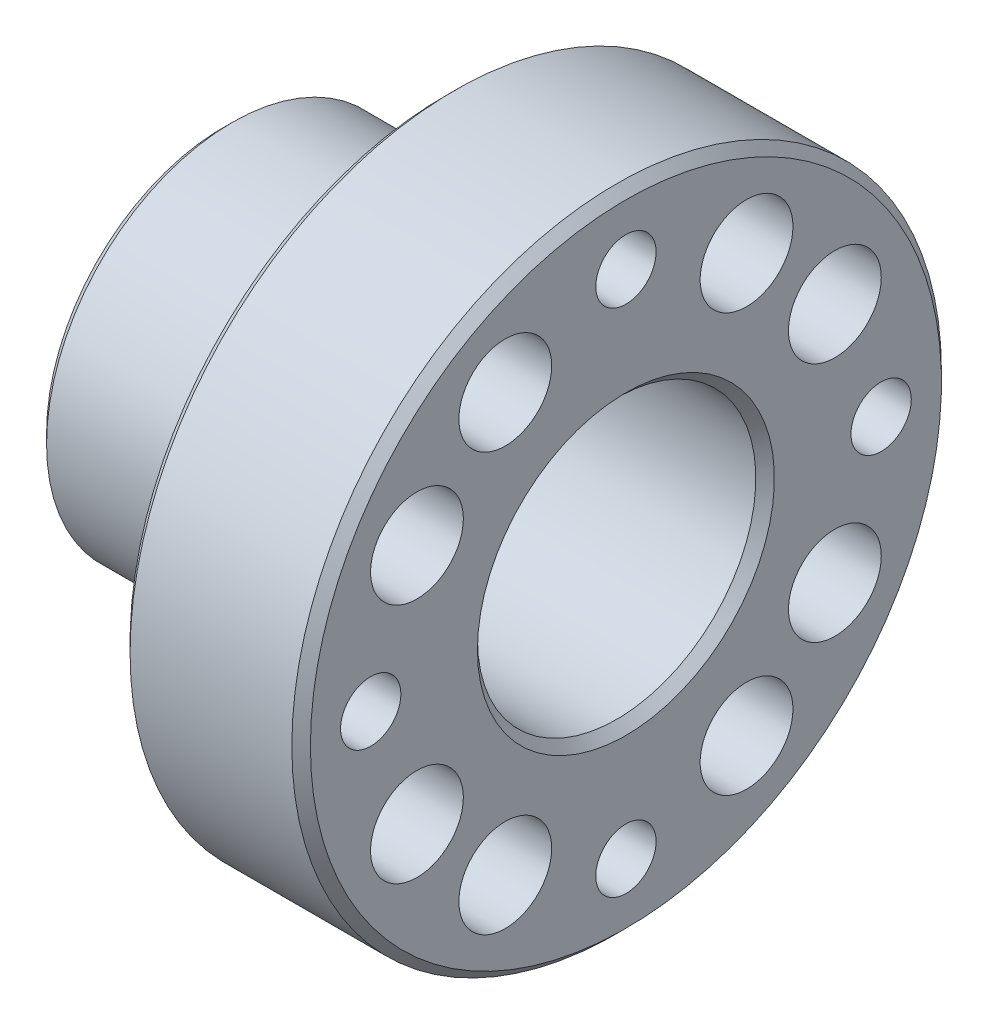
ISO-10303-21;
HEADER;
FILE_DESCRIPTION(('STEP AP214'),'2;1');
FILE_NAME('part.step','',(''),(''),'','','');
FILE_SCHEMA(('AUTOMOTIVE_DESIGN { 1 0 10303 214 1 1 1 1 }'));
ENDSEC;
DATA;
#1=APPLICATION_CONTEXT('core data for automotive mechanical design processes');
#2=APPLICATION_PROTOCOL_DEFINITION('international standard','automotive_design',2000,#1);
#3=PRODUCT_CONTEXT('',#1,'mechanical');
#4=PRODUCT('Part','Part','',(#3));
#5=PRODUCT_RELATED_PRODUCT_CATEGORY('part','',(#4));
#6=PRODUCT_DEFINITION_FORMATION('','',#4);
#7=PRODUCT_DEFINITION_CONTEXT('part definition',#1,'design');
#8=PRODUCT_DEFINITION('design','',#6,#7);
#9=PRODUCT_DEFINITION_SHAPE('','',#8);
#10=(LENGTH_UNIT() NAMED_UNIT(*) SI_UNIT(.MILLI.,.METRE.));
#11=(NAMED_UNIT(*) PLANE_ANGLE_UNIT() SI_UNIT($,.RADIAN.));
#12=(NAMED_UNIT(*) SI_UNIT($,.STERADIAN.) SOLID_ANGLE_UNIT());
#13=UNCERTAINTY_MEASURE_WITH_UNIT(LENGTH_MEASURE(1.E-05),#10,'distance_accuracy_value','');
#14=(GEOMETRIC_REPRESENTATION_CONTEXT(3) GLOBAL_UNCERTAINTY_ASSIGNED_CONTEXT((#13)) GLOBAL_UNIT_ASSIGNED_CONTEXT((#10,
#11,#12)) REPRESENTATION_CONTEXT('',''));
#15=CARTESIAN_POINT('',(0.,0.,0.));
#16=DIRECTION('',(0.,0.,1.));
#17=DIRECTION('',(1.,0.,0.));
#18=AXIS2_PLACEMENT_3D('',#15,#16,#17);
#19=CARTESIAN_POINT('',(0.,0.,-15.));
#20=DIRECTION('',(1.,0.,0.));
#21=DIRECTION('',(0.,0.,-1.));
#22=AXIS2_PLACEMENT_3D('',#19,#20,#21);
#23=PLANE('',#22);
#24=CARTESIAN_POINT('',(0.,0.,0.));
#25=DIRECTION('',(1.,0.,0.));
#26=DIRECTION('',(0.,0.,-1.));
#27=AXIS2_PLACEMENT_3D('',#24,#25,#26);
#28=CIRCLE('',#27,19.);
#29=CARTESIAN_POINT('',(0.,0.,-19.));
#30=VERTEX_POINT('',#29);
#31=EDGE_CURVE('E161',#30,#30,#28,.F.);
#32=ORIENTED_EDGE('',*,*,#31,.T.);
#33=EDGE_LOOP('',(#32));
#34=FACE_BOUND('',#33,.T.);
#35=CARTESIAN_POINT('',(0.,0.,0.));
#36=DIRECTION('',(1.,0.,0.));
#37=DIRECTION('',(0.,0.,-1.));
#38=AXIS2_PLACEMENT_3D('',#35,#36,#37);
#39=CIRCLE('',#38,16.);
#40=CARTESIAN_POINT('',(0.,0.,-16.));
#41=VERTEX_POINT('',#40);
#42=EDGE_CURVE('E158',#41,#41,#39,.T.);
#43=ORIENTED_EDGE('',*,*,#42,.T.);
#44=EDGE_LOOP('',(#43));
#45=FACE_BOUND('',#44,.T.);
#46=ADVANCED_FACE('F41',(#34,#45),#23,.F.);
#47=CARTESIAN_POINT('',(0.,0.,0.));
#48=DIRECTION('',(-1.,0.,0.));
#49=DIRECTION('',(0.,0.,1.));
#50=AXIS2_PLACEMENT_3D('',#47,#48,#49);
#51=CYLINDRICAL_SURFACE('',#50,20.);
#52=CARTESIAN_POINT('',(23.,0.,0.));
#53=DIRECTION('',(1.,0.,0.));
#54=DIRECTION('',(0.,0.,-1.));
#55=AXIS2_PLACEMENT_3D('',#52,#53,#54);
#56=CIRCLE('',#55,20.);
#57=CARTESIAN_POINT('',(23.,0.,-20.));
#58=VERTEX_POINT('',#57);
#59=EDGE_CURVE('E154',#58,#58,#56,.F.);
#60=ORIENTED_EDGE('',*,*,#59,.T.);
#61=EDGE_LOOP('',(#60));
#62=FACE_BOUND('',#61,.T.);
#63=CARTESIAN_POINT('',(1.00000000000001,0.,0.));
#64=DIRECTION('',(1.,0.,0.));
#65=DIRECTION('',(0.,0.,-1.));
#66=AXIS2_PLACEMENT_3D('',#63,#64,#65);
#67=CIRCLE('',#66,20.);
#68=CARTESIAN_POINT('',(1.00000000000001,0.,-20.));
#69=VERTEX_POINT('',#68);
#70=EDGE_CURVE('E151',#69,#69,#67,.T.);
#71=ORIENTED_EDGE('',*,*,#70,.T.);
#72=EDGE_LOOP('',(#71));
#73=FACE_BOUND('',#72,.T.);
#74=ADVANCED_FACE('F195',(#62,#73),#51,.T.);
#75=CARTESIAN_POINT('',(24.,0.,-20.));
#76=DIRECTION('',(1.,0.,0.));
#77=DIRECTION('',(0.,0.,-1.));
#78=AXIS2_PLACEMENT_3D('',#75,#76,#77);
#79=PLANE('',#78);
#80=CARTESIAN_POINT('',(24.,0.,0.));
#81=DIRECTION('',(1.,0.,0.));
#82=DIRECTION('',(0.,0.,-1.));
#83=AXIS2_PLACEMENT_3D('',#80,#81,#82);
#84=CIRCLE('',#83,34.);
#85=CARTESIAN_POINT('',(24.,0.,-34.));
#86=VERTEX_POINT('',#85);
#87=EDGE_CURVE('E147',#86,#86,#84,.F.);
#88=ORIENTED_EDGE('',*,*,#87,.T.);
#89=EDGE_LOOP('',(#88));
#90=FACE_BOUND('',#89,.T.);
#91=CARTESIAN_POINT('',(24.,0.,0.));
#92=DIRECTION('',(1.,0.,0.));
#93=DIRECTION('',(0.,0.,-1.));
#94=AXIS2_PLACEMENT_3D('',#91,#92,#93);
#95=CIRCLE('',#94,21.);
#96=CARTESIAN_POINT('',(24.,18.1865334794732,-10.5));
#97=VERTEX_POINT('',#96);
#98=CARTESIAN_POINT('',(24.,18.1865334794732,10.5));
#99=VERTEX_POINT('',#98);
#100=EDGE_CURVE('E98',#97,#99,#95,.T.);
#101=ORIENTED_EDGE('',*,*,#100,.T.);
#102=CARTESIAN_POINT('',(24.,22.5166604983954,13.));
#103=DIRECTION('',(1.,0.,0.));
#104=DIRECTION('',(0.,0.,-1.));
#105=AXIS2_PLACEMENT_3D('',#102,#103,#104);
#106=CIRCLE('',#105,5.);
#107=EDGE_CURVE('E54',#99,#99,#106,.T.);
#108=ORIENTED_EDGE('',*,*,#107,.T.);
#109=CARTESIAN_POINT('',(24.,10.5,18.1865334794732));
#110=VERTEX_POINT('',#109);
#111=EDGE_CURVE('E60',#99,#110,#95,.T.);
#112=ORIENTED_EDGE('',*,*,#111,.T.);
#113=CARTESIAN_POINT('',(24.,13.,22.5166604983954));
#114=DIRECTION('',(1.,0.,0.));
#115=DIRECTION('',(0.,0.,-1.));
#116=AXIS2_PLACEMENT_3D('',#113,#114,#115);
#117=CIRCLE('',#116,5.);
#118=EDGE_CURVE('E292',#110,#110,#117,.T.);
#119=ORIENTED_EDGE('',*,*,#118,.T.);
#120=CARTESIAN_POINT('',(24.,-10.5,18.1865334794732));
#121=VERTEX_POINT('',#120);
#122=EDGE_CURVE('E329',#110,#121,#95,.T.);
#123=ORIENTED_EDGE('',*,*,#122,.T.);
#124=CARTESIAN_POINT('',(24.,-13.,22.5166604983954));
#125=DIRECTION('',(1.,0.,0.));
#126=DIRECTION('',(0.,0.,-1.));
#127=AXIS2_PLACEMENT_3D('',#124,#125,#126);
#128=CIRCLE('',#127,5.);
#129=EDGE_CURVE('E297',#121,#121,#128,.T.);
#130=ORIENTED_EDGE('',*,*,#129,.T.);
#131=CARTESIAN_POINT('',(24.,-18.1865334794732,10.5));
#132=VERTEX_POINT('',#131);
#133=EDGE_CURVE('E326',#121,#132,#95,.T.);
#134=ORIENTED_EDGE('',*,*,#133,.T.);
#135=CARTESIAN_POINT('',(24.,-22.5166604983954,13.));
#136=DIRECTION('',(1.,0.,0.));
#137=DIRECTION('',(0.,0.,-1.));
#138=AXIS2_PLACEMENT_3D('',#135,#136,#137);
#139=CIRCLE('',#138,5.);
#140=EDGE_CURVE('E303',#132,#132,#139,.T.);
#141=ORIENTED_EDGE('',*,*,#140,.T.);
#142=CARTESIAN_POINT('',(24.,-18.1865334794732,-10.5));
#143=VERTEX_POINT('',#142);
#144=EDGE_CURVE('E323',#132,#143,#95,.T.);
#145=ORIENTED_EDGE('',*,*,#144,.T.);
#146=CARTESIAN_POINT('',(24.,-22.5166604983954,-13.));
#147=DIRECTION('',(1.,0.,0.));
#148=DIRECTION('',(0.,0.,-1.));
#149=AXIS2_PLACEMENT_3D('',#146,#147,#148);
#150=CIRCLE('',#149,5.);
#151=EDGE_CURVE('E309',#143,#143,#150,.T.);
#152=ORIENTED_EDGE('',*,*,#151,.T.);
#153=CARTESIAN_POINT('',(24.,-10.5,-18.1865334794732));
#154=VERTEX_POINT('',#153);
#155=EDGE_CURVE('E322',#143,#154,#95,.T.);
#156=ORIENTED_EDGE('',*,*,#155,.T.);
#157=CARTESIAN_POINT('',(24.,-13.,-22.5166604983954));
#158=DIRECTION('',(1.,0.,0.));
#159=DIRECTION('',(0.,0.,-1.));
#160=AXIS2_PLACEMENT_3D('',#157,#158,#159);
#161=CIRCLE('',#160,5.);
#162=EDGE_CURVE('E315',#154,#154,#161,.T.);
#163=ORIENTED_EDGE('',*,*,#162,.T.);
#164=CARTESIAN_POINT('',(24.,10.5,-18.1865334794732));
#165=VERTEX_POINT('',#164);
#166=EDGE_CURVE('E95',#154,#165,#95,.T.);
#167=ORIENTED_EDGE('',*,*,#166,.T.);
#168=CARTESIAN_POINT('',(24.,13.,-22.5166604983954));
#169=DIRECTION('',(1.,0.,0.));
#170=DIRECTION('',(0.,0.,-1.));
#171=AXIS2_PLACEMENT_3D('',#168,#169,#170);
#172=CIRCLE('',#171,5.);
#173=EDGE_CURVE('E91',#165,#165,#172,.T.);
#174=ORIENTED_EDGE('',*,*,#173,.T.);
#175=EDGE_CURVE('E83',#165,#97,#95,.T.);
#176=ORIENTED_EDGE('',*,*,#175,.T.);
#177=CARTESIAN_POINT('',(24.,22.5166604983954,-13.));
#178=DIRECTION('',(1.,0.,0.));
#179=DIRECTION('',(0.,0.,-1.));
#180=AXIS2_PLACEMENT_3D('',#177,#178,#179);
#181=CIRCLE('',#180,5.);
#182=EDGE_CURVE('E88',#97,#97,#181,.T.);
#183=ORIENTED_EDGE('',*,*,#182,.T.);
#184=EDGE_LOOP('',(#101,#108,#112,#119,#123,#130,#134,#141,#145,#152,#156,#163,#167,#174,#176,#183));
#185=FACE_BOUND('',#184,.T.);
#186=CARTESIAN_POINT('',(24.,-27.5,0.));
#187=DIRECTION('',(1.,0.,0.));
#188=DIRECTION('',(0.,0.,-1.));
#189=AXIS2_PLACEMENT_3D('',#186,#187,#188);
#190=CIRCLE('',#189,3.25);
#191=CARTESIAN_POINT('',(24.,-27.5,-3.25));
#192=VERTEX_POINT('',#191);
#193=EDGE_CURVE('E107',#192,#192,#190,.T.);
#194=ORIENTED_EDGE('',*,*,#193,.T.);
#195=EDGE_LOOP('',(#194));
#196=FACE_BOUND('',#195,.T.);
#197=CARTESIAN_POINT('',(24.,0.,27.5));
#198=DIRECTION('',(1.,0.,0.));
#199=DIRECTION('',(0.,0.,-1.));
#200=AXIS2_PLACEMENT_3D('',#197,#198,#199);
#201=CIRCLE('',#200,3.25);
#202=CARTESIAN_POINT('',(24.,0.,24.25));
#203=VERTEX_POINT('',#202);
#204=EDGE_CURVE('E119',#203,#203,#201,.T.);
#205=ORIENTED_EDGE('',*,*,#204,.T.);
#206=EDGE_LOOP('',(#205));
#207=FACE_BOUND('',#206,.T.);
#208=CARTESIAN_POINT('',(24.,0.,-27.5));
#209=DIRECTION('',(1.,0.,0.));
#210=DIRECTION('',(0.,0.,-1.));
#211=AXIS2_PLACEMENT_3D('',#208,#209,#210);
#212=CIRCLE('',#211,3.25);
#213=CARTESIAN_POINT('',(24.,0.,-30.75));
#214=VERTEX_POINT('',#213);
#215=EDGE_CURVE('E125',#214,#214,#212,.T.);
#216=ORIENTED_EDGE('',*,*,#215,.T.);
#217=EDGE_LOOP('',(#216));
#218=FACE_BOUND('',#217,.T.);
#219=CARTESIAN_POINT('',(24.,27.5,0.));
#220=DIRECTION('',(1.,0.,0.));
#221=DIRECTION('',(0.,0.,-1.));
#222=AXIS2_PLACEMENT_3D('',#219,#220,#221);
#223=CIRCLE('',#222,3.25);
#224=CARTESIAN_POINT('',(24.,27.5,-3.25));
#225=VERTEX_POINT('',#224);
#226=EDGE_CURVE('E132',#225,#225,#223,.T.);
#227=ORIENTED_EDGE('',*,*,#226,.T.);
#228=EDGE_LOOP('',(#227));
#229=FACE_BOUND('',#228,.T.);
#230=ADVANCED_FACE('F86',(#90,#185,#196,#207,#218,#229),#79,.F.);
#231=CARTESIAN_POINT('',(0.,0.,0.));
#232=DIRECTION('',(-1.,0.,0.));
#233=DIRECTION('',(0.,0.,1.));
#234=AXIS2_PLACEMENT_3D('',#231,#232,#233);
#235=CYLINDRICAL_SURFACE('',#234,35.);
#236=CARTESIAN_POINT('',(42.43,0.,0.));
#237=DIRECTION('',(-1.,0.,0.));
#238=DIRECTION('',(0.,0.,1.));
#239=AXIS2_PLACEMENT_3D('',#236,#237,#238);
#240=CIRCLE('',#239,35.);
#241=CARTESIAN_POINT('',(42.43,0.,35.));
#242=VERTEX_POINT('',#241);
#243=EDGE_CURVE('E139',#242,#242,#240,.T.);
#244=ORIENTED_EDGE('',*,*,#243,.T.);
#245=EDGE_LOOP('',(#244));
#246=FACE_BOUND('',#245,.T.);
#247=CARTESIAN_POINT('',(25.,0.,0.));
#248=DIRECTION('',(1.,0.,0.));
#249=DIRECTION('',(0.,0.,-1.));
#250=AXIS2_PLACEMENT_3D('',#247,#248,#249);
#251=CIRCLE('',#250,35.);
#252=CARTESIAN_POINT('',(25.,0.,-35.));
#253=VERTEX_POINT('',#252);
#254=EDGE_CURVE('E135',#253,#253,#251,.T.);
#255=ORIENTED_EDGE('',*,*,#254,.T.);
#256=EDGE_LOOP('',(#255));
#257=FACE_BOUND('',#256,.T.);
#258=ADVANCED_FACE('F176',(#246,#257),#235,.T.);
#259=CARTESIAN_POINT('',(43.43,0.,-35.));
#260=DIRECTION('',(-1.,0.,0.));
#261=DIRECTION('',(0.,0.,1.));
#262=AXIS2_PLACEMENT_3D('',#259,#260,#261);
#263=PLANE('',#262);
#264=CARTESIAN_POINT('',(43.43,22.5166604983954,13.));
#265=DIRECTION('',(1.,0.,0.));
#266=DIRECTION('',(0.,0.,-1.));
#267=AXIS2_PLACEMENT_3D('',#264,#265,#266);
#268=CIRCLE('',#267,5.);
#269=CARTESIAN_POINT('',(43.43,22.5166604983954,8.00000000000001));
#270=VERTEX_POINT('',#269);
#271=EDGE_CURVE('E285',#270,#270,#268,.T.);
#272=ORIENTED_EDGE('',*,*,#271,.F.);
#273=EDGE_LOOP('',(#272));
#274=FACE_BOUND('',#273,.T.);
#275=CARTESIAN_POINT('',(43.43,13.,22.5166604983954));
#276=DIRECTION('',(1.,0.,0.));
#277=DIRECTION('',(0.,0.,-1.));
#278=AXIS2_PLACEMENT_3D('',#275,#276,#277);
#279=CIRCLE('',#278,5.);
#280=CARTESIAN_POINT('',(43.43,13.,17.5166604983954));
#281=VERTEX_POINT('',#280);
#282=EDGE_CURVE('E287',#281,#281,#279,.T.);
#283=ORIENTED_EDGE('',*,*,#282,.F.);
#284=EDGE_LOOP('',(#283));
#285=FACE_BOUND('',#284,.T.);
#286=CARTESIAN_POINT('',(43.43,-13.,22.5166604983954));
#287=DIRECTION('',(1.,0.,0.));
#288=DIRECTION('',(0.,0.,-1.));
#289=AXIS2_PLACEMENT_3D('',#286,#287,#288);
#290=CIRCLE('',#289,5.);
#291=CARTESIAN_POINT('',(43.43,-13.,17.5166604983954));
#292=VERTEX_POINT('',#291);
#293=EDGE_CURVE('E294',#292,#292,#290,.T.);
#294=ORIENTED_EDGE('',*,*,#293,.F.);
#295=EDGE_LOOP('',(#294));
#296=FACE_BOUND('',#295,.T.);
#297=CARTESIAN_POINT('',(43.43,-22.5166604983954,13.));
#298=DIRECTION('',(1.,0.,0.));
#299=DIRECTION('',(0.,0.,-1.));
#300=AXIS2_PLACEMENT_3D('',#297,#298,#299);
#301=CIRCLE('',#300,5.);
#302=CARTESIAN_POINT('',(43.43,-22.5166604983954,8.00000000000001));
#303=VERTEX_POINT('',#302);
#304=EDGE_CURVE('E300',#303,#303,#301,.T.);
#305=ORIENTED_EDGE('',*,*,#304,.F.);
#306=EDGE_LOOP('',(#305));
#307=FACE_BOUND('',#306,.T.);
#308=CARTESIAN_POINT('',(43.43,-22.5166604983954,-13.));
#309=DIRECTION('',(1.,0.,0.));
#310=DIRECTION('',(0.,0.,-1.));
#311=AXIS2_PLACEMENT_3D('',#308,#309,#310);
#312=CIRCLE('',#311,5.);
#313=CARTESIAN_POINT('',(43.43,-22.5166604983954,-18.));
#314=VERTEX_POINT('',#313);
#315=EDGE_CURVE('E306',#314,#314,#312,.T.);
#316=ORIENTED_EDGE('',*,*,#315,.F.);
#317=EDGE_LOOP('',(#316));
#318=FACE_BOUND('',#317,.T.);
#319=CARTESIAN_POINT('',(43.43,-13.,-22.5166604983954));
#320=DIRECTION('',(1.,0.,0.));
#321=DIRECTION('',(0.,0.,-1.));
#322=AXIS2_PLACEMENT_3D('',#319,#320,#321);
#323=CIRCLE('',#322,5.);
#324=CARTESIAN_POINT('',(43.43,-13.,-27.5166604983954));
#325=VERTEX_POINT('',#324);
#326=EDGE_CURVE('E312',#325,#325,#323,.T.);
#327=ORIENTED_EDGE('',*,*,#326,.F.);
#328=EDGE_LOOP('',(#327));
#329=FACE_BOUND('',#328,.T.);
#330=CARTESIAN_POINT('',(43.43,13.,-22.5166604983954));
#331=DIRECTION('',(1.,0.,0.));
#332=DIRECTION('',(0.,0.,-1.));
#333=AXIS2_PLACEMENT_3D('',#330,#331,#332);
#334=CIRCLE('',#333,5.);
#335=CARTESIAN_POINT('',(43.43,13.,-27.5166604983954));
#336=VERTEX_POINT('',#335);
#337=EDGE_CURVE('E318',#336,#336,#334,.T.);
#338=ORIENTED_EDGE('',*,*,#337,.F.);
#339=EDGE_LOOP('',(#338));
#340=FACE_BOUND('',#339,.T.);
#341=CARTESIAN_POINT('',(43.43,22.5166604983954,-13.));
#342=DIRECTION('',(1.,0.,0.));
#343=DIRECTION('',(0.,0.,-1.));
#344=AXIS2_PLACEMENT_3D('',#341,#342,#343);
#345=CIRCLE('',#344,5.);
#346=CARTESIAN_POINT('',(43.43,22.5166604983954,-18.));
#347=VERTEX_POINT('',#346);
#348=EDGE_CURVE('E103',#347,#347,#345,.T.);
#349=ORIENTED_EDGE('',*,*,#348,.F.);
#350=EDGE_LOOP('',(#349));
#351=FACE_BOUND('',#350,.T.);
#352=CARTESIAN_POINT('',(43.43,0.,0.));
#353=DIRECTION('',(-1.,0.,0.));
#354=DIRECTION('',(0.,0.,1.));
#355=AXIS2_PLACEMENT_3D('',#352,#353,#354);
#356=CIRCLE('',#355,34.);
#357=CARTESIAN_POINT('',(43.43,0.,34.));
#358=VERTEX_POINT('',#357);
#359=EDGE_CURVE('E96',#358,#358,#356,.F.);
#360=ORIENTED_EDGE('',*,*,#359,.T.);
#361=EDGE_LOOP('',(#360));
#362=FACE_BOUND('',#361,.T.);
#363=CARTESIAN_POINT('',(43.43,0.,0.));
#364=DIRECTION('',(-1.,0.,0.));
#365=DIRECTION('',(0.,0.,1.));
#366=AXIS2_PLACEMENT_3D('',#363,#364,#365);
#367=CIRCLE('',#366,16.);
#368=CARTESIAN_POINT('',(43.43,0.,16.));
#369=VERTEX_POINT('',#368);
#370=EDGE_CURVE('E142',#369,#369,#367,.T.);
#371=ORIENTED_EDGE('',*,*,#370,.T.);
#372=EDGE_LOOP('',(#371));
#373=FACE_BOUND('',#372,.T.);
#374=CARTESIAN_POINT('',(43.43,-27.5,0.));
#375=DIRECTION('',(1.,0.,0.));
#376=DIRECTION('',(0.,0.,-1.));
#377=AXIS2_PLACEMENT_3D('',#374,#375,#376);
#378=CIRCLE('',#377,3.25);
#379=CARTESIAN_POINT('',(43.43,-27.5,-3.25));
#380=VERTEX_POINT('',#379);
#381=EDGE_CURVE('E102',#380,#380,#378,.T.);
#382=ORIENTED_EDGE('',*,*,#381,.F.);
#383=EDGE_LOOP('',(#382));
#384=FACE_BOUND('',#383,.T.);
#385=CARTESIAN_POINT('',(43.43,0.,27.5));
#386=DIRECTION('',(1.,0.,0.));
#387=DIRECTION('',(0.,0.,-1.));
#388=AXIS2_PLACEMENT_3D('',#385,#386,#387);
#389=CIRCLE('',#388,3.25);
#390=CARTESIAN_POINT('',(43.43,0.,24.25));
#391=VERTEX_POINT('',#390);
#392=EDGE_CURVE('E116',#391,#391,#389,.T.);
#393=ORIENTED_EDGE('',*,*,#392,.F.);
#394=EDGE_LOOP('',(#393));
#395=FACE_BOUND('',#394,.T.);
#396=CARTESIAN_POINT('',(43.43,0.,-27.5));
#397=DIRECTION('',(1.,0.,0.));
#398=DIRECTION('',(0.,0.,-1.));
#399=AXIS2_PLACEMENT_3D('',#396,#397,#398);
#400=CIRCLE('',#399,3.25);
#401=CARTESIAN_POINT('',(43.43,0.,-30.75));
#402=VERTEX_POINT('',#401);
#403=EDGE_CURVE('E122',#402,#402,#400,.T.);
#404=ORIENTED_EDGE('',*,*,#403,.F.);
#405=EDGE_LOOP('',(#404));
#406=FACE_BOUND('',#405,.T.);
#407=CARTESIAN_POINT('',(43.43,27.5,0.));
#408=DIRECTION('',(1.,0.,0.));
#409=DIRECTION('',(0.,0.,-1.));
#410=AXIS2_PLACEMENT_3D('',#407,#408,#409);
#411=CIRCLE('',#410,3.25);
#412=CARTESIAN_POINT('',(43.43,27.5,-3.25));
#413=VERTEX_POINT('',#412);
#414=EDGE_CURVE('E128',#413,#413,#411,.T.);
#415=ORIENTED_EDGE('',*,*,#414,.F.);
#416=EDGE_LOOP('',(#415));
#417=FACE_BOUND('',#416,.T.);
#418=ADVANCED_FACE('F173',(#274,#285,#296,#307,#318,#329,#340,#351,#362,#373,#384,#395,#406,
#417),#263,.F.);
#419=CARTESIAN_POINT('',(0.,0.,0.));
#420=DIRECTION('',(-1.,0.,0.));
#421=DIRECTION('',(0.,0.,1.));
#422=AXIS2_PLACEMENT_3D('',#419,#420,#421);
#423=CYLINDRICAL_SURFACE('',#422,15.);
#424=CARTESIAN_POINT('',(0.999999999999999,0.,0.));
#425=DIRECTION('',(1.,0.,0.));
#426=DIRECTION('',(0.,0.,-1.));
#427=AXIS2_PLACEMENT_3D('',#424,#425,#426);
#428=CIRCLE('',#427,15.);
#429=CARTESIAN_POINT('',(0.999999999999999,0.,-15.));
#430=VERTEX_POINT('',#429);
#431=EDGE_CURVE('E11',#430,#430,#428,.F.);
#432=ORIENTED_EDGE('',*,*,#431,.T.);
#433=EDGE_LOOP('',(#432));
#434=FACE_BOUND('',#433,.T.);
#435=CARTESIAN_POINT('',(42.43,0.,0.));
#436=DIRECTION('',(-1.,0.,0.));
#437=DIRECTION('',(0.,0.,1.));
#438=AXIS2_PLACEMENT_3D('',#435,#436,#437);
#439=CIRCLE('',#438,15.);
#440=CARTESIAN_POINT('',(42.43,0.,15.));
#441=VERTEX_POINT('',#440);
#442=EDGE_CURVE('E49',#441,#441,#439,.F.);
#443=ORIENTED_EDGE('',*,*,#442,.T.);
#444=EDGE_LOOP('',(#443));
#445=FACE_BOUND('',#444,.T.);
#446=ADVANCED_FACE('F166',(#434,#445),#423,.F.);
#447=CARTESIAN_POINT('',(0.,27.5,0.));
#448=DIRECTION('',(1.,0.,0.));
#449=DIRECTION('',(0.,0.,-1.));
#450=AXIS2_PLACEMENT_3D('',#447,#448,#449);
#451=CYLINDRICAL_SURFACE('',#450,3.25);
#452=ORIENTED_EDGE('',*,*,#414,.T.);
#453=EDGE_LOOP('',(#452));
#454=FACE_BOUND('',#453,.T.);
#455=ORIENTED_EDGE('',*,*,#226,.F.);
#456=EDGE_LOOP('',(#455));
#457=FACE_BOUND('',#456,.T.);
#458=ADVANCED_FACE('F187',(#454,#457),#451,.F.);
#459=CARTESIAN_POINT('',(0.,0.,-27.5));
#460=DIRECTION('',(1.,0.,0.));
#461=DIRECTION('',(0.,0.,-1.));
#462=AXIS2_PLACEMENT_3D('',#459,#460,#461);
#463=CYLINDRICAL_SURFACE('',#462,3.25);
#464=ORIENTED_EDGE('',*,*,#403,.T.);
#465=EDGE_LOOP('',(#464));
#466=FACE_BOUND('',#465,.T.);
#467=ORIENTED_EDGE('',*,*,#215,.F.);
#468=EDGE_LOOP('',(#467));
#469=FACE_BOUND('',#468,.T.);
#470=ADVANCED_FACE('F190',(#466,#469),#463,.F.);
#471=CARTESIAN_POINT('',(0.,0.,27.5));
#472=DIRECTION('',(1.,0.,0.));
#473=DIRECTION('',(0.,0.,-1.));
#474=AXIS2_PLACEMENT_3D('',#471,#472,#473);
#475=CYLINDRICAL_SURFACE('',#474,3.25);
#476=ORIENTED_EDGE('',*,*,#392,.T.);
#477=EDGE_LOOP('',(#476));
#478=FACE_BOUND('',#477,.T.);
#479=ORIENTED_EDGE('',*,*,#204,.F.);
#480=EDGE_LOOP('',(#479));
#481=FACE_BOUND('',#480,.T.);
#482=ADVANCED_FACE('F243',(#478,#481),#475,.F.);
#483=CARTESIAN_POINT('',(0.,-27.5,0.));
#484=DIRECTION('',(1.,0.,0.));
#485=DIRECTION('',(0.,0.,-1.));
#486=AXIS2_PLACEMENT_3D('',#483,#484,#485);
#487=CYLINDRICAL_SURFACE('',#486,3.25);
#488=ORIENTED_EDGE('',*,*,#381,.T.);
#489=EDGE_LOOP('',(#488));
#490=FACE_BOUND('',#489,.T.);
#491=ORIENTED_EDGE('',*,*,#193,.F.);
#492=EDGE_LOOP('',(#491));
#493=FACE_BOUND('',#492,.T.);
#494=ADVANCED_FACE('F217',(#490,#493),#487,.F.);
#495=CARTESIAN_POINT('',(42.43,0.,0.));
#496=DIRECTION('',(-1.,0.,0.));
#497=DIRECTION('',(0.,0.,1.));
#498=AXIS2_PLACEMENT_3D('',#495,#496,#497);
#499=CONICAL_SURFACE('',#498,35.,0.785398163397452);
#500=ORIENTED_EDGE('',*,*,#359,.F.);
#501=EDGE_LOOP('',(#500));
#502=FACE_BOUND('',#501,.T.);
#503=ORIENTED_EDGE('',*,*,#243,.F.);
#504=EDGE_LOOP('',(#503));
#505=FACE_BOUND('',#504,.T.);
#506=ADVANCED_FACE('F213',(#502,#505),#499,.T.);
#507=CARTESIAN_POINT('',(24.,0.,0.));
#508=DIRECTION('',(1.,0.,0.));
#509=DIRECTION('',(0.,0.,-1.));
#510=AXIS2_PLACEMENT_3D('',#507,#508,#509);
#511=CONICAL_SURFACE('',#510,34.,0.785398163397448);
#512=ORIENTED_EDGE('',*,*,#254,.F.);
#513=EDGE_LOOP('',(#512));
#514=FACE_BOUND('',#513,.T.);
#515=ORIENTED_EDGE('',*,*,#87,.F.);
#516=EDGE_LOOP('',(#515));
#517=FACE_BOUND('',#516,.T.);
#518=ADVANCED_FACE('F216',(#514,#517),#511,.T.);
#519=CARTESIAN_POINT('',(23.,0.,0.));
#520=DIRECTION('',(1.,0.,0.));
#521=DIRECTION('',(0.,0.,-1.));
#522=AXIS2_PLACEMENT_3D('',#519,#520,#521);
#523=CONICAL_SURFACE('',#522,20.,0.785398163397448);
#524=ORIENTED_EDGE('',*,*,#100,.F.);
#525=ORIENTED_EDGE('',*,*,#175,.F.);
#526=ORIENTED_EDGE('',*,*,#166,.F.);
#527=ORIENTED_EDGE('',*,*,#155,.F.);
#528=ORIENTED_EDGE('',*,*,#144,.F.);
#529=ORIENTED_EDGE('',*,*,#133,.F.);
#530=ORIENTED_EDGE('',*,*,#122,.F.);
#531=ORIENTED_EDGE('',*,*,#111,.F.);
#532=EDGE_LOOP('',(#524,#525,#526,#527,#528,#529,#530,#531));
#533=FACE_BOUND('',#532,.T.);
#534=ORIENTED_EDGE('',*,*,#59,.F.);
#535=EDGE_LOOP('',(#534));
#536=FACE_BOUND('',#535,.T.);
#537=ADVANCED_FACE('F221',(#533,#536),#523,.T.);
#538=CARTESIAN_POINT('',(0.,0.,0.));
#539=DIRECTION('',(1.,0.,0.));
#540=DIRECTION('',(0.,0.,-1.));
#541=AXIS2_PLACEMENT_3D('',#538,#539,#540);
#542=CONICAL_SURFACE('',#541,19.,0.785398163397448);
#543=ORIENTED_EDGE('',*,*,#70,.F.);
#544=EDGE_LOOP('',(#543));
#545=FACE_BOUND('',#544,.T.);
#546=ORIENTED_EDGE('',*,*,#31,.F.);
#547=EDGE_LOOP('',(#546));
#548=FACE_BOUND('',#547,.T.);
#549=ADVANCED_FACE('F225',(#545,#548),#542,.T.);
#550=CARTESIAN_POINT('',(0.999999999999999,0.,0.));
#551=DIRECTION('',(-1.,0.,0.));
#552=DIRECTION('',(0.,0.,1.));
#553=AXIS2_PLACEMENT_3D('',#550,#551,#552);
#554=CONICAL_SURFACE('',#553,15.,0.785398163397449);
#555=ORIENTED_EDGE('',*,*,#42,.F.);
#556=EDGE_LOOP('',(#555));
#557=FACE_BOUND('',#556,.T.);
#558=ORIENTED_EDGE('',*,*,#431,.F.);
#559=EDGE_LOOP('',(#558));
#560=FACE_BOUND('',#559,.T.);
#561=ADVANCED_FACE('F170',(#557,#560),#554,.F.);
#562=CARTESIAN_POINT('',(43.43,0.,0.));
#563=DIRECTION('',(1.,0.,0.));
#564=DIRECTION('',(0.,0.,-1.));
#565=AXIS2_PLACEMENT_3D('',#562,#563,#564);
#566=CONICAL_SURFACE('',#565,16.,0.785398163397445);
#567=ORIENTED_EDGE('',*,*,#442,.F.);
#568=EDGE_LOOP('',(#567));
#569=FACE_BOUND('',#568,.T.);
#570=ORIENTED_EDGE('',*,*,#370,.F.);
#571=EDGE_LOOP('',(#570));
#572=FACE_BOUND('',#571,.T.);
#573=ADVANCED_FACE('F43',(#569,#572),#566,.F.);
#574=CARTESIAN_POINT('',(0.,22.5166604983954,-13.));
#575=DIRECTION('',(1.,0.,0.));
#576=DIRECTION('',(0.,0.,-1.));
#577=AXIS2_PLACEMENT_3D('',#574,#575,#576);
#578=CYLINDRICAL_SURFACE('',#577,5.);
#579=ORIENTED_EDGE('',*,*,#348,.T.);
#580=EDGE_LOOP('',(#579));
#581=FACE_BOUND('',#580,.T.);
#582=ORIENTED_EDGE('',*,*,#182,.F.);
#583=EDGE_LOOP('',(#582));
#584=FACE_BOUND('',#583,.T.);
#585=ADVANCED_FACE('F100',(#581,#584),#578,.F.);
#586=CARTESIAN_POINT('',(0.,13.,-22.5166604983954));
#587=DIRECTION('',(1.,0.,0.));
#588=DIRECTION('',(0.,0.,-1.));
#589=AXIS2_PLACEMENT_3D('',#586,#587,#588);
#590=CYLINDRICAL_SURFACE('',#589,5.);
#591=ORIENTED_EDGE('',*,*,#337,.T.);
#592=EDGE_LOOP('',(#591));
#593=FACE_BOUND('',#592,.T.);
#594=ORIENTED_EDGE('',*,*,#173,.F.);
#595=EDGE_LOOP('',(#594));
#596=FACE_BOUND('',#595,.T.);
#597=ADVANCED_FACE('F253',(#593,#596),#590,.F.);
#598=CARTESIAN_POINT('',(0.,-13.,-22.5166604983954));
#599=DIRECTION('',(1.,0.,0.));
#600=DIRECTION('',(0.,0.,-1.));
#601=AXIS2_PLACEMENT_3D('',#598,#599,#600);
#602=CYLINDRICAL_SURFACE('',#601,5.);
#603=ORIENTED_EDGE('',*,*,#326,.T.);
#604=EDGE_LOOP('',(#603));
#605=FACE_BOUND('',#604,.T.);
#606=ORIENTED_EDGE('',*,*,#162,.F.);
#607=EDGE_LOOP('',(#606));
#608=FACE_BOUND('',#607,.T.);
#609=ADVANCED_FACE('F257',(#605,#608),#602,.F.);
#610=CARTESIAN_POINT('',(0.,-22.5166604983954,-13.));
#611=DIRECTION('',(1.,0.,0.));
#612=DIRECTION('',(0.,0.,-1.));
#613=AXIS2_PLACEMENT_3D('',#610,#611,#612);
#614=CYLINDRICAL_SURFACE('',#613,5.);
#615=ORIENTED_EDGE('',*,*,#315,.T.);
#616=EDGE_LOOP('',(#615));
#617=FACE_BOUND('',#616,.T.);
#618=ORIENTED_EDGE('',*,*,#151,.F.);
#619=EDGE_LOOP('',(#618));
#620=FACE_BOUND('',#619,.T.);
#621=ADVANCED_FACE('F261',(#617,#620),#614,.F.);
#622=CARTESIAN_POINT('',(0.,-22.5166604983954,13.));
#623=DIRECTION('',(1.,0.,0.));
#624=DIRECTION('',(0.,0.,-1.));
#625=AXIS2_PLACEMENT_3D('',#622,#623,#624);
#626=CYLINDRICAL_SURFACE('',#625,5.);
#627=ORIENTED_EDGE('',*,*,#304,.T.);
#628=EDGE_LOOP('',(#627));
#629=FACE_BOUND('',#628,.T.);
#630=ORIENTED_EDGE('',*,*,#140,.F.);
#631=EDGE_LOOP('',(#630));
#632=FACE_BOUND('',#631,.T.);
#633=ADVANCED_FACE('F265',(#629,#632),#626,.F.);
#634=CARTESIAN_POINT('',(0.,-13.,22.5166604983954));
#635=DIRECTION('',(1.,0.,0.));
#636=DIRECTION('',(0.,0.,-1.));
#637=AXIS2_PLACEMENT_3D('',#634,#635,#636);
#638=CYLINDRICAL_SURFACE('',#637,5.);
#639=ORIENTED_EDGE('',*,*,#293,.T.);
#640=EDGE_LOOP('',(#639));
#641=FACE_BOUND('',#640,.T.);
#642=ORIENTED_EDGE('',*,*,#129,.F.);
#643=EDGE_LOOP('',(#642));
#644=FACE_BOUND('',#643,.T.);
#645=ADVANCED_FACE('F269',(#641,#644),#638,.F.);
#646=CARTESIAN_POINT('',(0.,13.,22.5166604983954));
#647=DIRECTION('',(1.,0.,0.));
#648=DIRECTION('',(0.,0.,-1.));
#649=AXIS2_PLACEMENT_3D('',#646,#647,#648);
#650=CYLINDRICAL_SURFACE('',#649,5.);
#651=ORIENTED_EDGE('',*,*,#282,.T.);
#652=EDGE_LOOP('',(#651));
#653=FACE_BOUND('',#652,.T.);
#654=ORIENTED_EDGE('',*,*,#118,.F.);
#655=EDGE_LOOP('',(#654));
#656=FACE_BOUND('',#655,.T.);
#657=ADVANCED_FACE('F273',(#653,#656),#650,.F.);
#658=CARTESIAN_POINT('',(0.,22.5166604983954,13.));
#659=DIRECTION('',(1.,0.,0.));
#660=DIRECTION('',(0.,0.,-1.));
#661=AXIS2_PLACEMENT_3D('',#658,#659,#660);
#662=CYLINDRICAL_SURFACE('',#661,5.);
#663=ORIENTED_EDGE('',*,*,#271,.T.);
#664=EDGE_LOOP('',(#663));
#665=FACE_BOUND('',#664,.T.);
#666=ORIENTED_EDGE('',*,*,#107,.F.);
#667=EDGE_LOOP('',(#666));
#668=FACE_BOUND('',#667,.T.);
#669=ADVANCED_FACE('F277',(#665,#668),#662,.F.);
#670=CLOSED_SHELL('',(#46,#74,#230,#258,#418,#446,#458,#470,#482,#494,#506,#518,#537,#549,#561,
#573,#585,#597,#609,#621,#633,#645,#657,#669));
#671=MANIFOLD_SOLID_BREP('B2',#670);
#672=ADVANCED_BREP_SHAPE_REPRESENTATION('',(#18,#671),#14);
#673=SHAPE_DEFINITION_REPRESENTATION(#9,#672);
ENDSEC;
END-ISO-10303-21;
